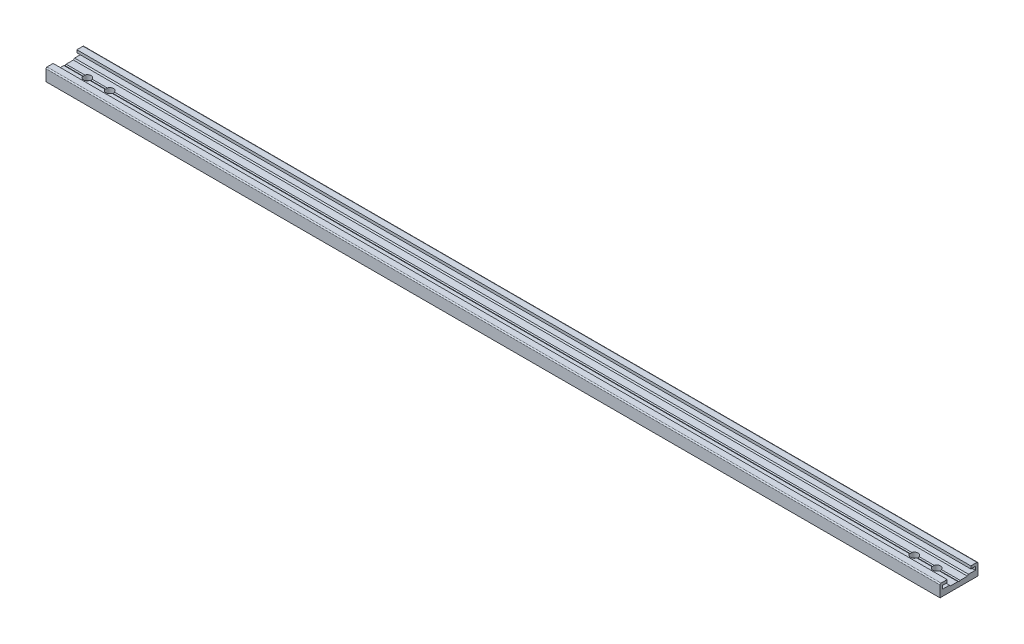
ISO-10303-21;
HEADER;
FILE_DESCRIPTION(('STEP AP214'),'2;1');
FILE_NAME('part.step','',(''),(''),'','','');
FILE_SCHEMA(('AUTOMOTIVE_DESIGN { 1 0 10303 214 1 1 1 1 }'));
ENDSEC;
DATA;
#1=APPLICATION_CONTEXT('core data for automotive mechanical design processes');
#2=APPLICATION_PROTOCOL_DEFINITION('international standard','automotive_design',2000,#1);
#3=PRODUCT_CONTEXT('',#1,'mechanical');
#4=PRODUCT('Part','Part','',(#3));
#5=PRODUCT_RELATED_PRODUCT_CATEGORY('part','',(#4));
#6=PRODUCT_DEFINITION_FORMATION('','',#4);
#7=PRODUCT_DEFINITION_CONTEXT('part definition',#1,'design');
#8=PRODUCT_DEFINITION('design','',#6,#7);
#9=PRODUCT_DEFINITION_SHAPE('','',#8);
#10=(LENGTH_UNIT() NAMED_UNIT(*) SI_UNIT(.MILLI.,.METRE.));
#11=(NAMED_UNIT(*) PLANE_ANGLE_UNIT() SI_UNIT($,.RADIAN.));
#12=(NAMED_UNIT(*) SI_UNIT($,.STERADIAN.) SOLID_ANGLE_UNIT());
#13=UNCERTAINTY_MEASURE_WITH_UNIT(LENGTH_MEASURE(1.E-05),#10,'distance_accuracy_value','');
#14=(GEOMETRIC_REPRESENTATION_CONTEXT(3) GLOBAL_UNCERTAINTY_ASSIGNED_CONTEXT((#13)) GLOBAL_UNIT_ASSIGNED_CONTEXT((#10,
#11,#12)) REPRESENTATION_CONTEXT('',''));
#15=CARTESIAN_POINT('',(0.,0.,0.));
#16=DIRECTION('',(0.,0.,1.));
#17=DIRECTION('',(1.,0.,0.));
#18=AXIS2_PLACEMENT_3D('',#15,#16,#17);
#19=CARTESIAN_POINT('',(400.,-0.45,0.499999998010386));
#20=DIRECTION('',(0.,-0.866025403784438,0.500000000000001));
#21=DIRECTION('',(0.,0.500000000000001,0.866025403784438));
#22=AXIS2_PLACEMENT_3D('',#19,#20,#21);
#23=PLANE('',#22);
#24=DIRECTION('',(-1.,0.,0.));
#25=VECTOR('',#24,1.);
#26=CARTESIAN_POINT('',(400.,-0.738675133446109,0.));
#27=LINE('',#26,#25);
#28=CARTESIAN_POINT('',(388.3,-0.738675133446109,0.));
#29=VERTEX_POINT('',#28);
#30=CARTESIAN_POINT('',(381.7,-0.738675133446109,0.));
#31=VERTEX_POINT('',#30);
#32=EDGE_CURVE('E547',#29,#31,#27,.T.);
#33=ORIENTED_EDGE('',*,*,#32,.T.);
#34=CARTESIAN_POINT('',(380.,-0.738675133446109,0.));
#35=DIRECTION('',(0.,0.866025403784438,-0.500000000000001));
#36=DIRECTION('',(0.,-0.500000000000001,-0.866025403784438));
#37=AXIS2_PLACEMENT_3D('',#34,#35,#36);
#38=ELLIPSE('',#37,1.9629909152447,1.69999999999998);
#39=CARTESIAN_POINT('',(381.624807681539,-0.45,0.499999998010386));
#40=VERTEX_POINT('',#39);
#41=EDGE_CURVE('E458',#40,#31,#38,.T.);
#42=ORIENTED_EDGE('',*,*,#41,.F.);
#43=DIRECTION('',(-1.,0.,0.));
#44=VECTOR('',#43,1.);
#45=CARTESIAN_POINT('',(400.,-0.45,0.499999998010386));
#46=LINE('',#45,#44);
#47=CARTESIAN_POINT('',(388.375192318461,-0.45,0.499999998010386));
#48=VERTEX_POINT('',#47);
#49=EDGE_CURVE('E550',#48,#40,#46,.T.);
#50=ORIENTED_EDGE('',*,*,#49,.F.);
#51=CARTESIAN_POINT('',(390.,-0.738675133446109,0.));
#52=DIRECTION('',(0.,0.866025403784438,-0.500000000000001));
#53=DIRECTION('',(0.,-0.500000000000001,-0.866025403784438));
#54=AXIS2_PLACEMENT_3D('',#51,#52,#53);
#55=ELLIPSE('',#54,1.9629909152447,1.69999999999998);
#56=EDGE_CURVE('E470',#29,#48,#55,.T.);
#57=ORIENTED_EDGE('',*,*,#56,.F.);
#58=EDGE_LOOP('',(#33,#42,#50,#57));
#59=FACE_BOUND('',#58,.T.);
#60=ADVANCED_FACE('F35',(#59),#23,.F.);
#61=CARTESIAN_POINT('',(400.,-0.45,-0.499999998010387));
#62=DIRECTION('',(0.,-0.866025403784438,-0.5));
#63=DIRECTION('',(0.,-0.5,0.866025403784439));
#64=AXIS2_PLACEMENT_3D('',#61,#62,#63);
#65=PLANE('',#64);
#66=CARTESIAN_POINT('',(400.,-0.738675133446109,0.));
#67=VERTEX_POINT('',#66);
#68=CARTESIAN_POINT('',(391.7,-0.738675133446109,0.));
#69=VERTEX_POINT('',#68);
#70=EDGE_CURVE('E543',#67,#69,#27,.T.);
#71=ORIENTED_EDGE('',*,*,#70,.F.);
#72=DIRECTION('',(0.,0.5,-0.866025403784438));
#73=VECTOR('',#72,1.);
#74=CARTESIAN_POINT('',(400.,-0.45,-0.499999998010387));
#75=LINE('',#74,#73);
#76=CARTESIAN_POINT('',(400.,-0.45,-0.499999998010387));
#77=VERTEX_POINT('',#76);
#78=EDGE_CURVE('E268',#67,#77,#75,.T.);
#79=ORIENTED_EDGE('',*,*,#78,.T.);
#80=DIRECTION('',(-1.,0.,0.));
#81=VECTOR('',#80,1.);
#82=CARTESIAN_POINT('',(400.,-0.45,-0.499999998010387));
#83=LINE('',#82,#81);
#84=CARTESIAN_POINT('',(391.624807681539,-0.450000000000001,-0.499999998010386));
#85=VERTEX_POINT('',#84);
#86=EDGE_CURVE('E251',#77,#85,#83,.T.);
#87=ORIENTED_EDGE('',*,*,#86,.T.);
#88=CARTESIAN_POINT('',(390.,-0.738675133446109,0.));
#89=DIRECTION('',(0.,0.866025403784438,0.5));
#90=DIRECTION('',(0.,-0.5,0.866025403784439));
#91=AXIS2_PLACEMENT_3D('',#88,#89,#90);
#92=ELLIPSE('',#91,1.9629909152447,1.69999999999998);
#93=EDGE_CURVE('E256',#69,#85,#92,.T.);
#94=ORIENTED_EDGE('',*,*,#93,.F.);
#95=EDGE_LOOP('',(#71,#79,#87,#94));
#96=FACE_BOUND('',#95,.T.);
#97=ADVANCED_FACE('F266',(#96),#65,.F.);
#98=CARTESIAN_POINT('',(388.375192318461,-0.450000000000001,-0.499999998010386));
#99=VERTEX_POINT('',#98);
#100=CARTESIAN_POINT('',(381.624807681539,-0.450000000000001,-0.499999998010386));
#101=VERTEX_POINT('',#100);
#102=EDGE_CURVE('E254',#99,#101,#83,.T.);
#103=ORIENTED_EDGE('',*,*,#102,.T.);
#104=CARTESIAN_POINT('',(380.,-0.738675133446109,0.));
#105=DIRECTION('',(0.,0.866025403784438,0.5));
#106=DIRECTION('',(0.,-0.5,0.866025403784439));
#107=AXIS2_PLACEMENT_3D('',#104,#105,#106);
#108=ELLIPSE('',#107,1.9629909152447,1.69999999999998);
#109=EDGE_CURVE('E461',#31,#101,#108,.T.);
#110=ORIENTED_EDGE('',*,*,#109,.F.);
#111=ORIENTED_EDGE('',*,*,#32,.F.);
#112=EDGE_CURVE('E264',#99,#29,#92,.T.);
#113=ORIENTED_EDGE('',*,*,#112,.F.);
#114=EDGE_LOOP('',(#103,#110,#111,#113));
#115=FACE_BOUND('',#114,.T.);
#116=ADVANCED_FACE('F496',(#115),#65,.F.);
#117=CARTESIAN_POINT('',(378.3,-0.738675133446109,0.));
#118=VERTEX_POINT('',#117);
#119=CARTESIAN_POINT('',(21.7000000000002,-0.738675133446109,0.));
#120=VERTEX_POINT('',#119);
#121=EDGE_CURVE('E275',#118,#120,#27,.T.);
#122=ORIENTED_EDGE('',*,*,#121,.T.);
#123=CARTESIAN_POINT('',(20.,-0.73867513344611,0.));
#124=DIRECTION('',(0.,0.866025403784438,-0.500000000000001));
#125=DIRECTION('',(0.,-0.500000000000001,-0.866025403784438));
#126=AXIS2_PLACEMENT_3D('',#123,#124,#125);
#127=ELLIPSE('',#126,1.96299091524472,1.69999999999999);
#128=CARTESIAN_POINT('',(21.6248076815395,-0.45,0.499999998010385));
#129=VERTEX_POINT('',#128);
#130=EDGE_CURVE('E377',#129,#120,#127,.T.);
#131=ORIENTED_EDGE('',*,*,#130,.F.);
#132=CARTESIAN_POINT('',(378.375192318461,-0.45,0.499999998010386));
#133=VERTEX_POINT('',#132);
#134=EDGE_CURVE('E545',#133,#129,#46,.T.);
#135=ORIENTED_EDGE('',*,*,#134,.F.);
#136=EDGE_CURVE('E457',#118,#133,#38,.T.);
#137=ORIENTED_EDGE('',*,*,#136,.F.);
#138=EDGE_LOOP('',(#122,#131,#135,#137));
#139=FACE_BOUND('',#138,.T.);
#140=ADVANCED_FACE('F491',(#139),#23,.F.);
#141=CARTESIAN_POINT('',(8.3000000000002,-0.738675133446109,0.));
#142=VERTEX_POINT('',#141);
#143=CARTESIAN_POINT('',(0.,-0.738675133446109,0.));
#144=VERTEX_POINT('',#143);
#145=EDGE_CURVE('E269',#142,#144,#27,.T.);
#146=ORIENTED_EDGE('',*,*,#145,.T.);
#147=DIRECTION('',(0.,-0.500000000000001,-0.866025403784438));
#148=VECTOR('',#147,1.);
#149=CARTESIAN_POINT('',(0.,-0.45,0.499999998010386));
#150=LINE('',#149,#148);
#151=CARTESIAN_POINT('',(0.,-0.45,0.499999998010386));
#152=VERTEX_POINT('',#151);
#153=EDGE_CURVE('E342',#152,#144,#150,.T.);
#154=ORIENTED_EDGE('',*,*,#153,.F.);
#155=CARTESIAN_POINT('',(8.37519231846057,-0.45,0.499999998010386));
#156=VERTEX_POINT('',#155);
#157=EDGE_CURVE('E539',#156,#152,#46,.T.);
#158=ORIENTED_EDGE('',*,*,#157,.F.);
#159=CARTESIAN_POINT('',(10.,-0.738675133446109,0.));
#160=DIRECTION('',(0.,0.866025403784438,-0.500000000000001));
#161=DIRECTION('',(0.,-0.500000000000001,-0.866025403784438));
#162=AXIS2_PLACEMENT_3D('',#159,#160,#161);
#163=ELLIPSE('',#162,1.96299091524472,1.69999999999999);
#164=EDGE_CURVE('E446',#142,#156,#163,.T.);
#165=ORIENTED_EDGE('',*,*,#164,.F.);
#166=EDGE_LOOP('',(#146,#154,#158,#165));
#167=FACE_BOUND('',#166,.T.);
#168=ADVANCED_FACE('F502',(#167),#23,.F.);
#169=CARTESIAN_POINT('',(18.3000000000002,-0.738675133446109,0.));
#170=VERTEX_POINT('',#169);
#171=CARTESIAN_POINT('',(11.7000000000002,-0.738675133446109,0.));
#172=VERTEX_POINT('',#171);
#173=EDGE_CURVE('E273',#170,#172,#27,.T.);
#174=ORIENTED_EDGE('',*,*,#173,.F.);
#175=CARTESIAN_POINT('',(20.,-0.738675133446109,0.));
#176=DIRECTION('',(0.,0.866025403784438,0.5));
#177=DIRECTION('',(0.,-0.5,0.866025403784439));
#178=AXIS2_PLACEMENT_3D('',#175,#176,#177);
#179=ELLIPSE('',#178,1.96299091524472,1.69999999999999);
#180=CARTESIAN_POINT('',(18.3751923184607,-0.45,-0.499999998010387));
#181=VERTEX_POINT('',#180);
#182=EDGE_CURVE('E586',#181,#170,#179,.T.);
#183=ORIENTED_EDGE('',*,*,#182,.F.);
#184=CARTESIAN_POINT('',(11.6248076815395,-0.450000000000001,-0.499999998010386));
#185=VERTEX_POINT('',#184);
#186=EDGE_CURVE('E271',#181,#185,#83,.T.);
#187=ORIENTED_EDGE('',*,*,#186,.T.);
#188=CARTESIAN_POINT('',(10.,-0.738675133446109,0.));
#189=DIRECTION('',(0.,0.866025403784438,0.5));
#190=DIRECTION('',(0.,-0.5,0.866025403784439));
#191=AXIS2_PLACEMENT_3D('',#188,#189,#190);
#192=ELLIPSE('',#191,1.96299091524472,1.69999999999999);
#193=EDGE_CURVE('E449',#172,#185,#192,.T.);
#194=ORIENTED_EDGE('',*,*,#193,.F.);
#195=EDGE_LOOP('',(#174,#183,#187,#194));
#196=FACE_BOUND('',#195,.T.);
#197=ADVANCED_FACE('F517',(#196),#65,.F.);
#198=CARTESIAN_POINT('',(18.3751923184606,-0.45,0.499999998010386));
#199=VERTEX_POINT('',#198);
#200=CARTESIAN_POINT('',(11.6248076815395,-0.45,0.499999998010386));
#201=VERTEX_POINT('',#200);
#202=EDGE_CURVE('E542',#199,#201,#46,.T.);
#203=ORIENTED_EDGE('',*,*,#202,.F.);
#204=EDGE_CURVE('E436',#170,#199,#127,.T.);
#205=ORIENTED_EDGE('',*,*,#204,.F.);
#206=ORIENTED_EDGE('',*,*,#173,.T.);
#207=EDGE_CURVE('E447',#201,#172,#163,.T.);
#208=ORIENTED_EDGE('',*,*,#207,.F.);
#209=EDGE_LOOP('',(#203,#205,#206,#208));
#210=FACE_BOUND('',#209,.T.);
#211=ADVANCED_FACE('F507',(#210),#23,.F.);
#212=CARTESIAN_POINT('',(378.375192318461,-0.450000000000001,-0.499999998010386));
#213=VERTEX_POINT('',#212);
#214=CARTESIAN_POINT('',(21.6248076815395,-0.450000000000001,-0.499999998010386));
#215=VERTEX_POINT('',#214);
#216=EDGE_CURVE('E276',#213,#215,#83,.T.);
#217=ORIENTED_EDGE('',*,*,#216,.T.);
#218=EDGE_CURVE('E588',#120,#215,#179,.T.);
#219=ORIENTED_EDGE('',*,*,#218,.F.);
#220=ORIENTED_EDGE('',*,*,#121,.F.);
#221=EDGE_CURVE('E462',#213,#118,#108,.T.);
#222=ORIENTED_EDGE('',*,*,#221,.F.);
#223=EDGE_LOOP('',(#217,#219,#220,#222));
#224=FACE_BOUND('',#223,.T.);
#225=ADVANCED_FACE('F512',(#224),#65,.F.);
#226=CARTESIAN_POINT('',(400.,-2.75,-8.49999999602077));
#227=DIRECTION('',(0.,0.,1.));
#228=DIRECTION('',(0.,1.,0.));
#229=AXIS2_PLACEMENT_3D('',#226,#227,#228);
#230=PLANE('',#229);
#231=DIRECTION('',(0.,-1.,0.));
#232=VECTOR('',#231,1.);
#233=CARTESIAN_POINT('',(0.,-2.75,-8.49999999602077));
#234=LINE('',#233,#232);
#235=CARTESIAN_POINT('',(0.,2.25,-8.49999999602078));
#236=VERTEX_POINT('',#235);
#237=CARTESIAN_POINT('',(0.,-2.75,-8.49999999602077));
#238=VERTEX_POINT('',#237);
#239=EDGE_CURVE('E374',#236,#238,#234,.T.);
#240=ORIENTED_EDGE('',*,*,#239,.F.);
#241=DIRECTION('',(-1.,0.,0.));
#242=VECTOR('',#241,1.);
#243=CARTESIAN_POINT('',(400.,2.25,-8.49999999602078));
#244=LINE('',#243,#242);
#245=CARTESIAN_POINT('',(400.,2.25,-8.49999999602078));
#246=VERTEX_POINT('',#245);
#247=EDGE_CURVE('E311',#246,#236,#244,.T.);
#248=ORIENTED_EDGE('',*,*,#247,.F.);
#249=DIRECTION('',(0.,-1.,0.));
#250=VECTOR('',#249,1.);
#251=CARTESIAN_POINT('',(400.,-2.75,-8.49999999602077));
#252=LINE('',#251,#250);
#253=CARTESIAN_POINT('',(400.,-2.75,-8.49999999602077));
#254=VERTEX_POINT('',#253);
#255=EDGE_CURVE('E317',#246,#254,#252,.T.);
#256=ORIENTED_EDGE('',*,*,#255,.T.);
#257=DIRECTION('',(-1.,0.,0.));
#258=VECTOR('',#257,1.);
#259=CARTESIAN_POINT('',(400.,-2.75,-8.49999999602077));
#260=LINE('',#259,#258);
#261=EDGE_CURVE('E583',#254,#238,#260,.T.);
#262=ORIENTED_EDGE('',*,*,#261,.T.);
#263=EDGE_LOOP('',(#240,#248,#256,#262));
#264=FACE_BOUND('',#263,.T.);
#265=ADVANCED_FACE('F37',(#264),#230,.F.);
#266=CARTESIAN_POINT('',(400.,-2.75,-8.49999999602077));
#267=DIRECTION('',(0.,1.,0.));
#268=DIRECTION('',(0.,0.,-1.));
#269=AXIS2_PLACEMENT_3D('',#266,#267,#268);
#270=PLANE('',#269);
#271=CARTESIAN_POINT('',(390.,-2.75,0.));
#272=DIRECTION('',(0.,1.,0.));
#273=DIRECTION('',(0.,0.,1.));
#274=AXIS2_PLACEMENT_3D('',#271,#272,#273);
#275=CIRCLE('',#274,1.69999999999998);
#276=CARTESIAN_POINT('',(390.,-2.75,1.69999999999998));
#277=VERTEX_POINT('',#276);
#278=EDGE_CURVE('E472',#277,#277,#275,.T.);
#279=ORIENTED_EDGE('',*,*,#278,.T.);
#280=EDGE_LOOP('',(#279));
#281=FACE_BOUND('',#280,.T.);
#282=CARTESIAN_POINT('',(380.,-2.75,0.));
#283=DIRECTION('',(0.,1.,0.));
#284=DIRECTION('',(0.,0.,1.));
#285=AXIS2_PLACEMENT_3D('',#282,#283,#284);
#286=CIRCLE('',#285,1.69999999999998);
#287=CARTESIAN_POINT('',(380.,-2.75,1.69999999999998));
#288=VERTEX_POINT('',#287);
#289=EDGE_CURVE('E465',#288,#288,#286,.T.);
#290=ORIENTED_EDGE('',*,*,#289,.T.);
#291=EDGE_LOOP('',(#290));
#292=FACE_BOUND('',#291,.T.);
#293=CARTESIAN_POINT('',(10.,-2.75,0.));
#294=DIRECTION('',(0.,1.,0.));
#295=DIRECTION('',(0.,0.,1.));
#296=AXIS2_PLACEMENT_3D('',#293,#294,#295);
#297=CIRCLE('',#296,1.69999999999999);
#298=CARTESIAN_POINT('',(10.,-2.75,1.69999999999999));
#299=VERTEX_POINT('',#298);
#300=EDGE_CURVE('E452',#299,#299,#297,.T.);
#301=ORIENTED_EDGE('',*,*,#300,.T.);
#302=EDGE_LOOP('',(#301));
#303=FACE_BOUND('',#302,.T.);
#304=CARTESIAN_POINT('',(20.,-2.75,0.));
#305=DIRECTION('',(0.,1.,0.));
#306=DIRECTION('',(0.,0.,1.));
#307=AXIS2_PLACEMENT_3D('',#304,#305,#306);
#308=CIRCLE('',#307,1.69999999999999);
#309=CARTESIAN_POINT('',(20.,-2.75,1.69999999999999));
#310=VERTEX_POINT('',#309);
#311=EDGE_CURVE('E441',#310,#310,#308,.T.);
#312=ORIENTED_EDGE('',*,*,#311,.T.);
#313=EDGE_LOOP('',(#312));
#314=FACE_BOUND('',#313,.T.);
#315=DIRECTION('',(0.,0.,1.));
#316=VECTOR('',#315,1.);
#317=CARTESIAN_POINT('',(0.,-2.75,-8.49999999602077));
#318=LINE('',#317,#316);
#319=CARTESIAN_POINT('',(0.,-2.75,8.49999999602077));
#320=VERTEX_POINT('',#319);
#321=EDGE_CURVE('E371',#238,#320,#318,.T.);
#322=ORIENTED_EDGE('',*,*,#321,.F.);
#323=ORIENTED_EDGE('',*,*,#261,.F.);
#324=DIRECTION('',(0.,0.,1.));
#325=VECTOR('',#324,1.);
#326=CARTESIAN_POINT('',(400.,-2.75,-8.49999999602077));
#327=LINE('',#326,#325);
#328=CARTESIAN_POINT('',(400.,-2.75,8.49999999602077));
#329=VERTEX_POINT('',#328);
#330=EDGE_CURVE('E429',#254,#329,#327,.T.);
#331=ORIENTED_EDGE('',*,*,#330,.T.);
#332=DIRECTION('',(-1.,0.,0.));
#333=VECTOR('',#332,1.);
#334=CARTESIAN_POINT('',(400.,-2.75,8.49999999602077));
#335=LINE('',#334,#333);
#336=EDGE_CURVE('E580',#329,#320,#335,.T.);
#337=ORIENTED_EDGE('',*,*,#336,.T.);
#338=EDGE_LOOP('',(#322,#323,#331,#337));
#339=FACE_BOUND('',#338,.T.);
#340=ADVANCED_FACE('F476',(#281,#292,#303,#314,#339),#270,.F.);
#341=CARTESIAN_POINT('',(400.,-2.75,8.49999999602077));
#342=DIRECTION('',(0.,0.,-1.));
#343=DIRECTION('',(1.,0.,0.));
#344=AXIS2_PLACEMENT_3D('',#341,#342,#343);
#345=PLANE('',#344);
#346=DIRECTION('',(0.,1.,0.));
#347=VECTOR('',#346,1.);
#348=CARTESIAN_POINT('',(0.,-2.75,8.49999999602077));
#349=LINE('',#348,#347);
#350=CARTESIAN_POINT('',(0.,2.25,8.49999999602077));
#351=VERTEX_POINT('',#350);
#352=EDGE_CURVE('E368',#320,#351,#349,.T.);
#353=ORIENTED_EDGE('',*,*,#352,.F.);
#354=ORIENTED_EDGE('',*,*,#336,.F.);
#355=DIRECTION('',(0.,1.,0.));
#356=VECTOR('',#355,1.);
#357=CARTESIAN_POINT('',(400.,-2.75,8.49999999602077));
#358=LINE('',#357,#356);
#359=CARTESIAN_POINT('',(400.,2.25,8.49999999602077));
#360=VERTEX_POINT('',#359);
#361=EDGE_CURVE('E426',#329,#360,#358,.T.);
#362=ORIENTED_EDGE('',*,*,#361,.T.);
#363=DIRECTION('',(-1.,0.,0.));
#364=VECTOR('',#363,1.);
#365=CARTESIAN_POINT('',(400.,2.25,8.49999999602077));
#366=LINE('',#365,#364);
#367=EDGE_CURVE('E577',#360,#351,#366,.T.);
#368=ORIENTED_EDGE('',*,*,#367,.T.);
#369=EDGE_LOOP('',(#353,#354,#362,#368));
#370=FACE_BOUND('',#369,.T.);
#371=ADVANCED_FACE('F792',(#370),#345,.F.);
#372=CARTESIAN_POINT('',(400.,2.25,7.99999999602077));
#373=DIRECTION('',(-1.,0.,0.));
#374=DIRECTION('',(0.,0.,-1.));
#375=AXIS2_PLACEMENT_3D('',#372,#373,#374);
#376=CYLINDRICAL_SURFACE('',#375,0.5);
#377=CARTESIAN_POINT('',(0.,2.25,7.99999999602077));
#378=DIRECTION('',(-1.,0.,0.));
#379=DIRECTION('',(0.,0.,1.));
#380=AXIS2_PLACEMENT_3D('',#377,#378,#379);
#381=CIRCLE('',#380,0.5);
#382=CARTESIAN_POINT('',(0.,2.75,7.99999999602077));
#383=VERTEX_POINT('',#382);
#384=EDGE_CURVE('E365',#351,#383,#381,.T.);
#385=ORIENTED_EDGE('',*,*,#384,.F.);
#386=ORIENTED_EDGE('',*,*,#367,.F.);
#387=CARTESIAN_POINT('',(400.,2.25,7.99999999602077));
#388=DIRECTION('',(-1.,0.,0.));
#389=DIRECTION('',(0.,0.,1.));
#390=AXIS2_PLACEMENT_3D('',#387,#388,#389);
#391=CIRCLE('',#390,0.5);
#392=CARTESIAN_POINT('',(400.,2.75,7.99999999602077));
#393=VERTEX_POINT('',#392);
#394=EDGE_CURVE('E423',#360,#393,#391,.T.);
#395=ORIENTED_EDGE('',*,*,#394,.T.);
#396=DIRECTION('',(-1.,0.,0.));
#397=VECTOR('',#396,1.);
#398=CARTESIAN_POINT('',(400.,2.75,7.99999999602077));
#399=LINE('',#398,#397);
#400=EDGE_CURVE('E574',#393,#383,#399,.T.);
#401=ORIENTED_EDGE('',*,*,#400,.T.);
#402=EDGE_LOOP('',(#385,#386,#395,#401));
#403=FACE_BOUND('',#402,.T.);
#404=ADVANCED_FACE('F800',(#403),#376,.T.);
#405=CARTESIAN_POINT('',(400.,2.75,7.99999999602077));
#406=DIRECTION('',(0.,-1.,0.));
#407=DIRECTION('',(0.,0.,1.));
#408=AXIS2_PLACEMENT_3D('',#405,#406,#407);
#409=PLANE('',#408);
#410=DIRECTION('',(0.,0.,-1.));
#411=VECTOR('',#410,1.);
#412=CARTESIAN_POINT('',(0.,2.75,7.99999999602077));
#413=LINE('',#412,#411);
#414=CARTESIAN_POINT('',(0.,2.75,5.29999999602078));
#415=VERTEX_POINT('',#414);
#416=EDGE_CURVE('E362',#383,#415,#413,.T.);
#417=ORIENTED_EDGE('',*,*,#416,.F.);
#418=ORIENTED_EDGE('',*,*,#400,.F.);
#419=DIRECTION('',(0.,0.,-1.));
#420=VECTOR('',#419,1.);
#421=CARTESIAN_POINT('',(400.,2.75,7.99999999602077));
#422=LINE('',#421,#420);
#423=CARTESIAN_POINT('',(400.,2.75,5.29999999602078));
#424=VERTEX_POINT('',#423);
#425=EDGE_CURVE('E420',#393,#424,#422,.T.);
#426=ORIENTED_EDGE('',*,*,#425,.T.);
#427=DIRECTION('',(-1.,0.,0.));
#428=VECTOR('',#427,1.);
#429=CARTESIAN_POINT('',(400.,2.75,5.29999999602078));
#430=LINE('',#429,#428);
#431=EDGE_CURVE('E571',#424,#415,#430,.T.);
#432=ORIENTED_EDGE('',*,*,#431,.T.);
#433=EDGE_LOOP('',(#417,#418,#426,#432));
#434=FACE_BOUND('',#433,.T.);
#435=ADVANCED_FACE('F810',(#434),#409,.F.);
#436=CARTESIAN_POINT('',(400.,2.75,5.29999999602078));
#437=DIRECTION('',(0.,0.,1.));
#438=DIRECTION('',(0.,1.,0.));
#439=AXIS2_PLACEMENT_3D('',#436,#437,#438);
#440=PLANE('',#439);
#441=DIRECTION('',(0.,-1.,0.));
#442=VECTOR('',#441,1.);
#443=CARTESIAN_POINT('',(0.,2.75,5.29999999602078));
#444=LINE('',#443,#442);
#445=CARTESIAN_POINT('',(0.,1.55,5.29999999602078));
#446=VERTEX_POINT('',#445);
#447=EDGE_CURVE('E359',#415,#446,#444,.T.);
#448=ORIENTED_EDGE('',*,*,#447,.F.);
#449=ORIENTED_EDGE('',*,*,#431,.F.);
#450=DIRECTION('',(0.,-1.,0.));
#451=VECTOR('',#450,1.);
#452=CARTESIAN_POINT('',(400.,2.75,5.29999999602078));
#453=LINE('',#452,#451);
#454=CARTESIAN_POINT('',(400.,1.55,5.29999999602078));
#455=VERTEX_POINT('',#454);
#456=EDGE_CURVE('E417',#424,#455,#453,.T.);
#457=ORIENTED_EDGE('',*,*,#456,.T.);
#458=DIRECTION('',(-1.,0.,0.));
#459=VECTOR('',#458,1.);
#460=CARTESIAN_POINT('',(400.,1.55,5.29999999602078));
#461=LINE('',#460,#459);
#462=EDGE_CURVE('E568',#455,#446,#461,.T.);
#463=ORIENTED_EDGE('',*,*,#462,.T.);
#464=EDGE_LOOP('',(#448,#449,#457,#463));
#465=FACE_BOUND('',#464,.T.);
#466=ADVANCED_FACE('F820',(#465),#440,.F.);
#467=CARTESIAN_POINT('',(400.,1.55,5.29999999602078));
#468=DIRECTION('',(0.,1.,0.));
#469=DIRECTION('',(0.,0.,-1.));
#470=AXIS2_PLACEMENT_3D('',#467,#468,#469);
#471=PLANE('',#470);
#472=DIRECTION('',(0.,0.,1.));
#473=VECTOR('',#472,1.);
#474=CARTESIAN_POINT('',(0.,1.55,5.29999999602078));
#475=LINE('',#474,#473);
#476=CARTESIAN_POINT('',(0.,1.55,7.29999999801039));
#477=VERTEX_POINT('',#476);
#478=EDGE_CURVE('E356',#446,#477,#475,.T.);
#479=ORIENTED_EDGE('',*,*,#478,.F.);
#480=ORIENTED_EDGE('',*,*,#462,.F.);
#481=DIRECTION('',(0.,0.,1.));
#482=VECTOR('',#481,1.);
#483=CARTESIAN_POINT('',(400.,1.55,5.29999999602078));
#484=LINE('',#483,#482);
#485=CARTESIAN_POINT('',(400.,1.55,7.29999999801039));
#486=VERTEX_POINT('',#485);
#487=EDGE_CURVE('E414',#455,#486,#484,.T.);
#488=ORIENTED_EDGE('',*,*,#487,.T.);
#489=DIRECTION('',(-1.,0.,0.));
#490=VECTOR('',#489,1.);
#491=CARTESIAN_POINT('',(400.,1.55,7.29999999801039));
#492=LINE('',#491,#490);
#493=EDGE_CURVE('E565',#486,#477,#492,.T.);
#494=ORIENTED_EDGE('',*,*,#493,.T.);
#495=EDGE_LOOP('',(#479,#480,#488,#494));
#496=FACE_BOUND('',#495,.T.);
#497=ADVANCED_FACE('F830',(#496),#471,.F.);
#498=CARTESIAN_POINT('',(400.,1.55,7.29999999801039));
#499=DIRECTION('',(0.,0.,1.));
#500=DIRECTION('',(0.,1.,0.));
#501=AXIS2_PLACEMENT_3D('',#498,#499,#500);
#502=PLANE('',#501);
#503=DIRECTION('',(0.,-1.,0.));
#504=VECTOR('',#503,1.);
#505=CARTESIAN_POINT('',(0.,1.55,7.29999999801039));
#506=LINE('',#505,#504);
#507=CARTESIAN_POINT('',(0.,0.0500000000000036,7.29999999801039));
#508=VERTEX_POINT('',#507);
#509=EDGE_CURVE('E353',#477,#508,#506,.T.);
#510=ORIENTED_EDGE('',*,*,#509,.F.);
#511=ORIENTED_EDGE('',*,*,#493,.F.);
#512=DIRECTION('',(0.,-1.,0.));
#513=VECTOR('',#512,1.);
#514=CARTESIAN_POINT('',(400.,1.55,7.29999999801039));
#515=LINE('',#514,#513);
#516=CARTESIAN_POINT('',(400.,0.0500000000000036,7.29999999801039));
#517=VERTEX_POINT('',#516);
#518=EDGE_CURVE('E411',#486,#517,#515,.T.);
#519=ORIENTED_EDGE('',*,*,#518,.T.);
#520=DIRECTION('',(-1.,0.,0.));
#521=VECTOR('',#520,1.);
#522=CARTESIAN_POINT('',(400.,0.0500000000000036,7.29999999801039));
#523=LINE('',#522,#521);
#524=EDGE_CURVE('E560',#517,#508,#523,.T.);
#525=ORIENTED_EDGE('',*,*,#524,.T.);
#526=EDGE_LOOP('',(#510,#511,#519,#525));
#527=FACE_BOUND('',#526,.T.);
#528=ADVANCED_FACE('F840',(#527),#502,.F.);
#529=CARTESIAN_POINT('',(400.,0.0500000000000036,7.29999999801039));
#530=DIRECTION('',(0.,-1.,0.));
#531=DIRECTION('',(0.,0.,1.));
#532=AXIS2_PLACEMENT_3D('',#529,#530,#531);
#533=PLANE('',#532);
#534=DIRECTION('',(0.,0.,-1.));
#535=VECTOR('',#534,1.);
#536=CARTESIAN_POINT('',(0.,0.0500000000000036,7.29999999801039));
#537=LINE('',#536,#535);
#538=CARTESIAN_POINT('',(0.,0.0500000000000001,4.24999999801039));
#539=VERTEX_POINT('',#538);
#540=EDGE_CURVE('E350',#508,#539,#537,.T.);
#541=ORIENTED_EDGE('',*,*,#540,.F.);
#542=ORIENTED_EDGE('',*,*,#524,.F.);
#543=DIRECTION('',(0.,0.,-1.));
#544=VECTOR('',#543,1.);
#545=CARTESIAN_POINT('',(400.,0.0500000000000036,7.29999999801039));
#546=LINE('',#545,#544);
#547=CARTESIAN_POINT('',(400.,0.0500000000000001,4.24999999801039));
#548=VERTEX_POINT('',#547);
#549=EDGE_CURVE('E408',#517,#548,#546,.T.);
#550=ORIENTED_EDGE('',*,*,#549,.T.);
#551=DIRECTION('',(-1.,0.,0.));
#552=VECTOR('',#551,1.);
#553=CARTESIAN_POINT('',(400.,0.0500000000000001,4.24999999801039));
#554=LINE('',#553,#552);
#555=EDGE_CURVE('E557',#548,#539,#554,.T.);
#556=ORIENTED_EDGE('',*,*,#555,.T.);
#557=EDGE_LOOP('',(#541,#542,#550,#556));
#558=FACE_BOUND('',#557,.T.);
#559=ADVANCED_FACE('F850',(#558),#533,.F.);
#560=CARTESIAN_POINT('',(400.,0.0500000000000001,4.24999999801039));
#561=DIRECTION('',(0.,-0.707106781186548,0.707106781186548));
#562=DIRECTION('',(0.,0.707106781186548,0.707106781186548));
#563=AXIS2_PLACEMENT_3D('',#560,#561,#562);
#564=PLANE('',#563);
#565=DIRECTION('',(0.,-0.707106781186548,-0.707106781186548));
#566=VECTOR('',#565,1.);
#567=CARTESIAN_POINT('',(0.,0.0500000000000001,4.24999999801039));
#568=LINE('',#567,#566);
#569=CARTESIAN_POINT('',(0.,-0.45,3.74999999801039));
#570=VERTEX_POINT('',#569);
#571=EDGE_CURVE('E347',#539,#570,#568,.T.);
#572=ORIENTED_EDGE('',*,*,#571,.F.);
#573=ORIENTED_EDGE('',*,*,#555,.F.);
#574=DIRECTION('',(0.,-0.707106781186548,-0.707106781186548));
#575=VECTOR('',#574,1.);
#576=CARTESIAN_POINT('',(400.,0.0500000000000001,4.24999999801039));
#577=LINE('',#576,#575);
#578=CARTESIAN_POINT('',(400.,-0.45,3.74999999801039));
#579=VERTEX_POINT('',#578);
#580=EDGE_CURVE('E405',#548,#579,#577,.T.);
#581=ORIENTED_EDGE('',*,*,#580,.T.);
#582=DIRECTION('',(-1.,0.,0.));
#583=VECTOR('',#582,1.);
#584=CARTESIAN_POINT('',(400.,-0.45,3.74999999801039));
#585=LINE('',#584,#583);
#586=EDGE_CURVE('E556',#579,#570,#585,.T.);
#587=ORIENTED_EDGE('',*,*,#586,.T.);
#588=EDGE_LOOP('',(#572,#573,#581,#587));
#589=FACE_BOUND('',#588,.T.);
#590=ADVANCED_FACE('F513',(#589),#564,.F.);
#591=CARTESIAN_POINT('',(400.,-0.45,3.74999999801039));
#592=DIRECTION('',(0.,-1.,0.));
#593=DIRECTION('',(0.,0.,1.));
#594=AXIS2_PLACEMENT_3D('',#591,#592,#593);
#595=PLANE('',#594);
#596=ORIENTED_EDGE('',*,*,#49,.T.);
#597=CARTESIAN_POINT('',(380.,-0.45,0.));
#598=DIRECTION('',(0.,1.,0.));
#599=DIRECTION('',(0.,0.,1.));
#600=AXIS2_PLACEMENT_3D('',#597,#598,#599);
#601=CIRCLE('',#600,1.69999999999998);
#602=EDGE_CURVE('E455',#133,#40,#601,.T.);
#603=ORIENTED_EDGE('',*,*,#602,.F.);
#604=ORIENTED_EDGE('',*,*,#134,.T.);
#605=CARTESIAN_POINT('',(20.,-0.45,0.));
#606=DIRECTION('',(0.,1.,0.));
#607=DIRECTION('',(0.,0.,1.));
#608=AXIS2_PLACEMENT_3D('',#605,#606,#607);
#609=CIRCLE('',#608,1.69999999999999);
#610=EDGE_CURVE('E434',#199,#129,#609,.T.);
#611=ORIENTED_EDGE('',*,*,#610,.F.);
#612=ORIENTED_EDGE('',*,*,#202,.T.);
#613=CARTESIAN_POINT('',(10.,-0.45,0.));
#614=DIRECTION('',(0.,1.,0.));
#615=DIRECTION('',(0.,0.,1.));
#616=AXIS2_PLACEMENT_3D('',#613,#614,#615);
#617=CIRCLE('',#616,1.69999999999999);
#618=EDGE_CURVE('E444',#156,#201,#617,.T.);
#619=ORIENTED_EDGE('',*,*,#618,.F.);
#620=ORIENTED_EDGE('',*,*,#157,.T.);
#621=DIRECTION('',(0.,0.,-1.));
#622=VECTOR('',#621,1.);
#623=CARTESIAN_POINT('',(0.,-0.45,3.74999999801039));
#624=LINE('',#623,#622);
#625=EDGE_CURVE('E345',#570,#152,#624,.T.);
#626=ORIENTED_EDGE('',*,*,#625,.F.);
#627=ORIENTED_EDGE('',*,*,#586,.F.);
#628=DIRECTION('',(0.,0.,-1.));
#629=VECTOR('',#628,1.);
#630=CARTESIAN_POINT('',(400.,-0.45,3.74999999801039));
#631=LINE('',#630,#629);
#632=CARTESIAN_POINT('',(400.,-0.45,0.499999998010386));
#633=VERTEX_POINT('',#632);
#634=EDGE_CURVE('E402',#579,#633,#631,.T.);
#635=ORIENTED_EDGE('',*,*,#634,.T.);
#636=CARTESIAN_POINT('',(391.624807681539,-0.45,0.499999998010386));
#637=VERTEX_POINT('',#636);
#638=EDGE_CURVE('E546',#633,#637,#46,.T.);
#639=ORIENTED_EDGE('',*,*,#638,.T.);
#640=CARTESIAN_POINT('',(390.,-0.45,0.));
#641=DIRECTION('',(0.,1.,0.));
#642=DIRECTION('',(0.,0.,1.));
#643=AXIS2_PLACEMENT_3D('',#640,#641,#642);
#644=CIRCLE('',#643,1.69999999999998);
#645=EDGE_CURVE('E468',#48,#637,#644,.T.);
#646=ORIENTED_EDGE('',*,*,#645,.F.);
#647=EDGE_LOOP('',(#596,#603,#604,#611,#612,#619,#620,#626,#627,#635,#639,#646));
#648=FACE_BOUND('',#647,.T.);
#649=ADVANCED_FACE('F505',(#648),#595,.F.);
#650=ORIENTED_EDGE('',*,*,#638,.F.);
#651=DIRECTION('',(0.,-0.500000000000001,-0.866025403784438));
#652=VECTOR('',#651,1.);
#653=CARTESIAN_POINT('',(400.,-0.45,0.499999998010386));
#654=LINE('',#653,#652);
#655=EDGE_CURVE('E400',#633,#67,#654,.T.);
#656=ORIENTED_EDGE('',*,*,#655,.T.);
#657=ORIENTED_EDGE('',*,*,#70,.T.);
#658=EDGE_CURVE('E260',#637,#69,#55,.T.);
#659=ORIENTED_EDGE('',*,*,#658,.F.);
#660=EDGE_LOOP('',(#650,#656,#657,#659));
#661=FACE_BOUND('',#660,.T.);
#662=ADVANCED_FACE('F492',(#661),#23,.F.);
#663=CARTESIAN_POINT('',(8.37519231846056,-0.450000000000001,-0.499999998010386));
#664=VERTEX_POINT('',#663);
#665=CARTESIAN_POINT('',(0.,-0.45,-0.499999998010387));
#666=VERTEX_POINT('',#665);
#667=EDGE_CURVE('E279',#664,#666,#83,.T.);
#668=ORIENTED_EDGE('',*,*,#667,.T.);
#669=DIRECTION('',(0.,0.5,-0.866025403784438));
#670=VECTOR('',#669,1.);
#671=CARTESIAN_POINT('',(0.,-0.45,-0.499999998010387));
#672=LINE('',#671,#670);
#673=EDGE_CURVE('E339',#144,#666,#672,.T.);
#674=ORIENTED_EDGE('',*,*,#673,.F.);
#675=ORIENTED_EDGE('',*,*,#145,.F.);
#676=EDGE_CURVE('E450',#664,#142,#192,.T.);
#677=ORIENTED_EDGE('',*,*,#676,.F.);
#678=EDGE_LOOP('',(#668,#674,#675,#677));
#679=FACE_BOUND('',#678,.T.);
#680=ADVANCED_FACE('F498',(#679),#65,.F.);
#681=CARTESIAN_POINT('',(400.,-0.450000000000002,-3.74999999801039));
#682=DIRECTION('',(0.,-1.,0.));
#683=DIRECTION('',(0.,0.,1.));
#684=AXIS2_PLACEMENT_3D('',#681,#682,#683);
#685=PLANE('',#684);
#686=ORIENTED_EDGE('',*,*,#86,.F.);
#687=DIRECTION('',(0.,0.,-1.));
#688=VECTOR('',#687,1.);
#689=CARTESIAN_POINT('',(400.,-0.450000000000002,-3.74999999801039));
#690=LINE('',#689,#688);
#691=CARTESIAN_POINT('',(400.,-0.450000000000002,-3.74999999801039));
#692=VERTEX_POINT('',#691);
#693=EDGE_CURVE('E397',#77,#692,#690,.T.);
#694=ORIENTED_EDGE('',*,*,#693,.T.);
#695=DIRECTION('',(-1.,0.,0.));
#696=VECTOR('',#695,1.);
#697=CARTESIAN_POINT('',(400.,-0.450000000000002,-3.74999999801039));
#698=LINE('',#697,#696);
#699=CARTESIAN_POINT('',(0.,-0.450000000000002,-3.74999999801039));
#700=VERTEX_POINT('',#699);
#701=EDGE_CURVE('E286',#692,#700,#698,.T.);
#702=ORIENTED_EDGE('',*,*,#701,.T.);
#703=DIRECTION('',(0.,0.,-1.));
#704=VECTOR('',#703,1.);
#705=CARTESIAN_POINT('',(0.,-0.450000000000002,-3.74999999801039));
#706=LINE('',#705,#704);
#707=EDGE_CURVE('E336',#666,#700,#706,.T.);
#708=ORIENTED_EDGE('',*,*,#707,.F.);
#709=ORIENTED_EDGE('',*,*,#667,.F.);
#710=CARTESIAN_POINT('',(10.,-0.45,0.));
#711=DIRECTION('',(0.,1.,0.));
#712=DIRECTION('',(0.,0.,1.));
#713=AXIS2_PLACEMENT_3D('',#710,#711,#712);
#714=CIRCLE('',#713,1.69999999999999);
#715=EDGE_CURVE('E43',#185,#664,#714,.T.);
#716=ORIENTED_EDGE('',*,*,#715,.F.);
#717=ORIENTED_EDGE('',*,*,#186,.F.);
#718=CARTESIAN_POINT('',(20.,-0.45,0.));
#719=DIRECTION('',(0.,1.,0.));
#720=DIRECTION('',(0.,0.,1.));
#721=AXIS2_PLACEMENT_3D('',#718,#719,#720);
#722=CIRCLE('',#721,1.69999999999999);
#723=EDGE_CURVE('E439',#215,#181,#722,.T.);
#724=ORIENTED_EDGE('',*,*,#723,.F.);
#725=ORIENTED_EDGE('',*,*,#216,.F.);
#726=CARTESIAN_POINT('',(380.,-0.45,0.));
#727=DIRECTION('',(0.,1.,0.));
#728=DIRECTION('',(0.,0.,1.));
#729=AXIS2_PLACEMENT_3D('',#726,#727,#728);
#730=CIRCLE('',#729,1.69999999999998);
#731=EDGE_CURVE('E56',#101,#213,#730,.T.);
#732=ORIENTED_EDGE('',*,*,#731,.F.);
#733=ORIENTED_EDGE('',*,*,#102,.F.);
#734=CARTESIAN_POINT('',(390.,-0.45,0.));
#735=DIRECTION('',(0.,1.,0.));
#736=DIRECTION('',(0.,0.,1.));
#737=AXIS2_PLACEMENT_3D('',#734,#735,#736);
#738=CIRCLE('',#737,1.69999999999998);
#739=EDGE_CURVE('E11',#85,#99,#738,.T.);
#740=ORIENTED_EDGE('',*,*,#739,.F.);
#741=EDGE_LOOP('',(#686,#694,#702,#708,#709,#716,#717,#724,#725,#732,#733,#740));
#742=FACE_BOUND('',#741,.T.);
#743=ADVANCED_FACE('F248',(#742),#685,.F.);
#744=CARTESIAN_POINT('',(400.,0.0499999999999984,-4.24999999801039));
#745=DIRECTION('',(0.,-0.707106781186548,-0.707106781186547));
#746=DIRECTION('',(0.,-0.707106781186547,0.707106781186548));
#747=AXIS2_PLACEMENT_3D('',#744,#745,#746);
#748=PLANE('',#747);
#749=DIRECTION('',(0.,0.707106781186547,-0.707106781186548));
#750=VECTOR('',#749,1.);
#751=CARTESIAN_POINT('',(0.,0.0499999999999984,-4.24999999801039));
#752=LINE('',#751,#750);
#753=CARTESIAN_POINT('',(0.,0.0499999999999984,-4.24999999801039));
#754=VERTEX_POINT('',#753);
#755=EDGE_CURVE('E333',#700,#754,#752,.T.);
#756=ORIENTED_EDGE('',*,*,#755,.F.);
#757=ORIENTED_EDGE('',*,*,#701,.F.);
#758=DIRECTION('',(0.,0.707106781186547,-0.707106781186548));
#759=VECTOR('',#758,1.);
#760=CARTESIAN_POINT('',(400.,0.0499999999999984,-4.24999999801039));
#761=LINE('',#760,#759);
#762=CARTESIAN_POINT('',(400.,0.0499999999999984,-4.24999999801039));
#763=VERTEX_POINT('',#762);
#764=EDGE_CURVE('E394',#692,#763,#761,.T.);
#765=ORIENTED_EDGE('',*,*,#764,.T.);
#766=DIRECTION('',(-1.,0.,0.));
#767=VECTOR('',#766,1.);
#768=CARTESIAN_POINT('',(400.,0.0499999999999984,-4.24999999801039));
#769=LINE('',#768,#767);
#770=EDGE_CURVE('E291',#763,#754,#769,.T.);
#771=ORIENTED_EDGE('',*,*,#770,.T.);
#772=EDGE_LOOP('',(#756,#757,#765,#771));
#773=FACE_BOUND('',#772,.T.);
#774=ADVANCED_FACE('F640',(#773),#748,.F.);
#775=CARTESIAN_POINT('',(400.,0.050000000000001,-7.29999999801039));
#776=DIRECTION('',(0.,-1.,0.));
#777=DIRECTION('',(0.,0.,1.));
#778=AXIS2_PLACEMENT_3D('',#775,#776,#777);
#779=PLANE('',#778);
#780=DIRECTION('',(0.,0.,-1.));
#781=VECTOR('',#780,1.);
#782=CARTESIAN_POINT('',(0.,0.050000000000001,-7.29999999801039));
#783=LINE('',#782,#781);
#784=CARTESIAN_POINT('',(0.,0.050000000000001,-7.29999999801039));
#785=VERTEX_POINT('',#784);
#786=EDGE_CURVE('E330',#754,#785,#783,.T.);
#787=ORIENTED_EDGE('',*,*,#786,.F.);
#788=ORIENTED_EDGE('',*,*,#770,.F.);
#789=DIRECTION('',(0.,0.,-1.));
#790=VECTOR('',#789,1.);
#791=CARTESIAN_POINT('',(400.,0.050000000000001,-7.29999999801039));
#792=LINE('',#791,#790);
#793=CARTESIAN_POINT('',(400.,0.050000000000001,-7.29999999801039));
#794=VERTEX_POINT('',#793);
#795=EDGE_CURVE('E391',#763,#794,#792,.T.);
#796=ORIENTED_EDGE('',*,*,#795,.T.);
#797=DIRECTION('',(-1.,0.,0.));
#798=VECTOR('',#797,1.);
#799=CARTESIAN_POINT('',(400.,0.050000000000001,-7.29999999801039));
#800=LINE('',#799,#798);
#801=EDGE_CURVE('E294',#794,#785,#800,.T.);
#802=ORIENTED_EDGE('',*,*,#801,.T.);
#803=EDGE_LOOP('',(#787,#788,#796,#802));
#804=FACE_BOUND('',#803,.T.);
#805=ADVANCED_FACE('F636',(#804),#779,.F.);
#806=CARTESIAN_POINT('',(400.,1.55,-7.29999999801039));
#807=DIRECTION('',(0.,0.,-1.));
#808=DIRECTION('',(0.,-1.,0.));
#809=AXIS2_PLACEMENT_3D('',#806,#807,#808);
#810=PLANE('',#809);
#811=DIRECTION('',(0.,1.,0.));
#812=VECTOR('',#811,1.);
#813=CARTESIAN_POINT('',(0.,1.55,-7.29999999801039));
#814=LINE('',#813,#812);
#815=CARTESIAN_POINT('',(0.,1.55,-7.29999999801039));
#816=VERTEX_POINT('',#815);
#817=EDGE_CURVE('E327',#785,#816,#814,.T.);
#818=ORIENTED_EDGE('',*,*,#817,.F.);
#819=ORIENTED_EDGE('',*,*,#801,.F.);
#820=DIRECTION('',(0.,1.,0.));
#821=VECTOR('',#820,1.);
#822=CARTESIAN_POINT('',(400.,1.55,-7.29999999801039));
#823=LINE('',#822,#821);
#824=CARTESIAN_POINT('',(400.,1.55,-7.29999999801039));
#825=VERTEX_POINT('',#824);
#826=EDGE_CURVE('E388',#794,#825,#823,.T.);
#827=ORIENTED_EDGE('',*,*,#826,.T.);
#828=DIRECTION('',(-1.,0.,0.));
#829=VECTOR('',#828,1.);
#830=CARTESIAN_POINT('',(400.,1.55,-7.29999999801039));
#831=LINE('',#830,#829);
#832=EDGE_CURVE('E299',#825,#816,#831,.T.);
#833=ORIENTED_EDGE('',*,*,#832,.T.);
#834=EDGE_LOOP('',(#818,#819,#827,#833));
#835=FACE_BOUND('',#834,.T.);
#836=ADVANCED_FACE('F632',(#835),#810,.F.);
#837=CARTESIAN_POINT('',(400.,1.55,-5.29999999602078));
#838=DIRECTION('',(0.,1.,0.));
#839=DIRECTION('',(0.,0.,-1.));
#840=AXIS2_PLACEMENT_3D('',#837,#838,#839);
#841=PLANE('',#840);
#842=DIRECTION('',(0.,0.,1.));
#843=VECTOR('',#842,1.);
#844=CARTESIAN_POINT('',(0.,1.55,-5.29999999602078));
#845=LINE('',#844,#843);
#846=CARTESIAN_POINT('',(0.,1.55,-5.29999999602078));
#847=VERTEX_POINT('',#846);
#848=EDGE_CURVE('E324',#816,#847,#845,.T.);
#849=ORIENTED_EDGE('',*,*,#848,.F.);
#850=ORIENTED_EDGE('',*,*,#832,.F.);
#851=DIRECTION('',(0.,0.,1.));
#852=VECTOR('',#851,1.);
#853=CARTESIAN_POINT('',(400.,1.55,-5.29999999602078));
#854=LINE('',#853,#852);
#855=CARTESIAN_POINT('',(400.,1.55,-5.29999999602078));
#856=VERTEX_POINT('',#855);
#857=EDGE_CURVE('E385',#825,#856,#854,.T.);
#858=ORIENTED_EDGE('',*,*,#857,.T.);
#859=DIRECTION('',(-1.,0.,0.));
#860=VECTOR('',#859,1.);
#861=CARTESIAN_POINT('',(400.,1.55,-5.29999999602078));
#862=LINE('',#861,#860);
#863=EDGE_CURVE('E302',#856,#847,#862,.T.);
#864=ORIENTED_EDGE('',*,*,#863,.T.);
#865=EDGE_LOOP('',(#849,#850,#858,#864));
#866=FACE_BOUND('',#865,.T.);
#867=ADVANCED_FACE('F628',(#866),#841,.F.);
#868=CARTESIAN_POINT('',(400.,2.75,-5.29999999602078));
#869=DIRECTION('',(0.,0.,-1.));
#870=DIRECTION('',(0.,-1.,0.));
#871=AXIS2_PLACEMENT_3D('',#868,#869,#870);
#872=PLANE('',#871);
#873=DIRECTION('',(0.,1.,0.));
#874=VECTOR('',#873,1.);
#875=CARTESIAN_POINT('',(0.,2.75,-5.29999999602078));
#876=LINE('',#875,#874);
#877=CARTESIAN_POINT('',(0.,2.75,-5.29999999602078));
#878=VERTEX_POINT('',#877);
#879=EDGE_CURVE('E321',#847,#878,#876,.T.);
#880=ORIENTED_EDGE('',*,*,#879,.F.);
#881=ORIENTED_EDGE('',*,*,#863,.F.);
#882=DIRECTION('',(0.,1.,0.));
#883=VECTOR('',#882,1.);
#884=CARTESIAN_POINT('',(400.,2.75,-5.29999999602078));
#885=LINE('',#884,#883);
#886=CARTESIAN_POINT('',(400.,2.75,-5.29999999602078));
#887=VERTEX_POINT('',#886);
#888=EDGE_CURVE('E382',#856,#887,#885,.T.);
#889=ORIENTED_EDGE('',*,*,#888,.T.);
#890=DIRECTION('',(-1.,0.,0.));
#891=VECTOR('',#890,1.);
#892=CARTESIAN_POINT('',(400.,2.75,-5.29999999602078));
#893=LINE('',#892,#891);
#894=EDGE_CURVE('E305',#887,#878,#893,.T.);
#895=ORIENTED_EDGE('',*,*,#894,.T.);
#896=EDGE_LOOP('',(#880,#881,#889,#895));
#897=FACE_BOUND('',#896,.T.);
#898=ADVANCED_FACE('F624',(#897),#872,.F.);
#899=CARTESIAN_POINT('',(400.,2.75,-7.99999999602078));
#900=DIRECTION('',(0.,-1.,0.));
#901=DIRECTION('',(0.,0.,1.));
#902=AXIS2_PLACEMENT_3D('',#899,#900,#901);
#903=PLANE('',#902);
#904=DIRECTION('',(0.,0.,-1.));
#905=VECTOR('',#904,1.);
#906=CARTESIAN_POINT('',(0.,2.75,-7.99999999602078));
#907=LINE('',#906,#905);
#908=CARTESIAN_POINT('',(0.,2.75,-7.99999999602078));
#909=VERTEX_POINT('',#908);
#910=EDGE_CURVE('E318',#878,#909,#907,.T.);
#911=ORIENTED_EDGE('',*,*,#910,.F.);
#912=ORIENTED_EDGE('',*,*,#894,.F.);
#913=DIRECTION('',(0.,0.,-1.));
#914=VECTOR('',#913,1.);
#915=CARTESIAN_POINT('',(400.,2.75,-7.99999999602078));
#916=LINE('',#915,#914);
#917=CARTESIAN_POINT('',(400.,2.75,-7.99999999602078));
#918=VERTEX_POINT('',#917);
#919=EDGE_CURVE('E379',#887,#918,#916,.T.);
#920=ORIENTED_EDGE('',*,*,#919,.T.);
#921=DIRECTION('',(-1.,0.,0.));
#922=VECTOR('',#921,1.);
#923=CARTESIAN_POINT('',(400.,2.75,-7.99999999602078));
#924=LINE('',#923,#922);
#925=EDGE_CURVE('E308',#918,#909,#924,.T.);
#926=ORIENTED_EDGE('',*,*,#925,.T.);
#927=EDGE_LOOP('',(#911,#912,#920,#926));
#928=FACE_BOUND('',#927,.T.);
#929=ADVANCED_FACE('F620',(#928),#903,.F.);
#930=CARTESIAN_POINT('',(400.,2.25,-7.99999999602078));
#931=DIRECTION('',(-1.,0.,0.));
#932=DIRECTION('',(0.,0.,-1.));
#933=AXIS2_PLACEMENT_3D('',#930,#931,#932);
#934=CYLINDRICAL_SURFACE('',#933,0.5);
#935=CARTESIAN_POINT('',(0.,2.25,-7.99999999602078));
#936=DIRECTION('',(-1.,0.,0.));
#937=DIRECTION('',(0.,0.,1.));
#938=AXIS2_PLACEMENT_3D('',#935,#936,#937);
#939=CIRCLE('',#938,0.5);
#940=EDGE_CURVE('E315',#909,#236,#939,.T.);
#941=ORIENTED_EDGE('',*,*,#940,.F.);
#942=ORIENTED_EDGE('',*,*,#925,.F.);
#943=CARTESIAN_POINT('',(400.,2.25,-7.99999999602078));
#944=DIRECTION('',(-1.,0.,0.));
#945=DIRECTION('',(0.,0.,1.));
#946=AXIS2_PLACEMENT_3D('',#943,#944,#945);
#947=CIRCLE('',#946,0.5);
#948=EDGE_CURVE('E314',#918,#246,#947,.T.);
#949=ORIENTED_EDGE('',*,*,#948,.T.);
#950=ORIENTED_EDGE('',*,*,#247,.T.);
#951=EDGE_LOOP('',(#941,#942,#949,#950));
#952=FACE_BOUND('',#951,.T.);
#953=ADVANCED_FACE('F614',(#952),#934,.T.);
#954=CARTESIAN_POINT('',(400.,2.25,-7.99999999602078));
#955=DIRECTION('',(1.,0.,0.));
#956=DIRECTION('',(0.,0.,1.));
#957=AXIS2_PLACEMENT_3D('',#954,#955,#956);
#958=PLANE('',#957);
#959=ORIENTED_EDGE('',*,*,#255,.F.);
#960=ORIENTED_EDGE('',*,*,#948,.F.);
#961=ORIENTED_EDGE('',*,*,#919,.F.);
#962=ORIENTED_EDGE('',*,*,#888,.F.);
#963=ORIENTED_EDGE('',*,*,#857,.F.);
#964=ORIENTED_EDGE('',*,*,#826,.F.);
#965=ORIENTED_EDGE('',*,*,#795,.F.);
#966=ORIENTED_EDGE('',*,*,#764,.F.);
#967=ORIENTED_EDGE('',*,*,#693,.F.);
#968=ORIENTED_EDGE('',*,*,#78,.F.);
#969=ORIENTED_EDGE('',*,*,#655,.F.);
#970=ORIENTED_EDGE('',*,*,#634,.F.);
#971=ORIENTED_EDGE('',*,*,#580,.F.);
#972=ORIENTED_EDGE('',*,*,#549,.F.);
#973=ORIENTED_EDGE('',*,*,#518,.F.);
#974=ORIENTED_EDGE('',*,*,#487,.F.);
#975=ORIENTED_EDGE('',*,*,#456,.F.);
#976=ORIENTED_EDGE('',*,*,#425,.F.);
#977=ORIENTED_EDGE('',*,*,#394,.F.);
#978=ORIENTED_EDGE('',*,*,#361,.F.);
#979=ORIENTED_EDGE('',*,*,#330,.F.);
#980=EDGE_LOOP('',(#959,#960,#961,#962,#963,#964,#965,#966,#967,#968,#969,#970,#971,#972,#973,
#974,#975,#976,#977,#978,#979));
#981=FACE_BOUND('',#980,.T.);
#982=ADVANCED_FACE('F611',(#981),#958,.T.);
#983=CARTESIAN_POINT('',(0.,2.25,-7.99999999602078));
#984=DIRECTION('',(1.,0.,0.));
#985=DIRECTION('',(0.,0.,1.));
#986=AXIS2_PLACEMENT_3D('',#983,#984,#985);
#987=PLANE('',#986);
#988=ORIENTED_EDGE('',*,*,#239,.T.);
#989=ORIENTED_EDGE('',*,*,#321,.T.);
#990=ORIENTED_EDGE('',*,*,#352,.T.);
#991=ORIENTED_EDGE('',*,*,#384,.T.);
#992=ORIENTED_EDGE('',*,*,#416,.T.);
#993=ORIENTED_EDGE('',*,*,#447,.T.);
#994=ORIENTED_EDGE('',*,*,#478,.T.);
#995=ORIENTED_EDGE('',*,*,#509,.T.);
#996=ORIENTED_EDGE('',*,*,#540,.T.);
#997=ORIENTED_EDGE('',*,*,#571,.T.);
#998=ORIENTED_EDGE('',*,*,#625,.T.);
#999=ORIENTED_EDGE('',*,*,#153,.T.);
#1000=ORIENTED_EDGE('',*,*,#673,.T.);
#1001=ORIENTED_EDGE('',*,*,#707,.T.);
#1002=ORIENTED_EDGE('',*,*,#755,.T.);
#1003=ORIENTED_EDGE('',*,*,#786,.T.);
#1004=ORIENTED_EDGE('',*,*,#817,.T.);
#1005=ORIENTED_EDGE('',*,*,#848,.T.);
#1006=ORIENTED_EDGE('',*,*,#879,.T.);
#1007=ORIENTED_EDGE('',*,*,#910,.T.);
#1008=ORIENTED_EDGE('',*,*,#940,.T.);
#1009=EDGE_LOOP('',(#988,#989,#990,#991,#992,#993,#994,#995,#996,#997,#998,#999,#1000,#1001,
#1002,#1003,#1004,#1005,#1006,#1007,#1008));
#1010=FACE_BOUND('',#1009,.T.);
#1011=ADVANCED_FACE('F535',(#1010),#987,.F.);
#1012=CARTESIAN_POINT('',(20.,-2.75,0.));
#1013=DIRECTION('',(0.,-1.,0.));
#1014=DIRECTION('',(0.,0.,1.));
#1015=AXIS2_PLACEMENT_3D('',#1012,#1013,#1014);
#1016=CYLINDRICAL_SURFACE('',#1015,1.69999999999999);
#1017=ORIENTED_EDGE('',*,*,#311,.F.);
#1018=EDGE_LOOP('',(#1017));
#1019=FACE_BOUND('',#1018,.T.);
#1020=ORIENTED_EDGE('',*,*,#610,.T.);
#1021=ORIENTED_EDGE('',*,*,#130,.T.);
#1022=ORIENTED_EDGE('',*,*,#218,.T.);
#1023=ORIENTED_EDGE('',*,*,#723,.T.);
#1024=ORIENTED_EDGE('',*,*,#182,.T.);
#1025=ORIENTED_EDGE('',*,*,#204,.T.);
#1026=EDGE_LOOP('',(#1020,#1021,#1022,#1023,#1024,#1025));
#1027=FACE_BOUND('',#1026,.T.);
#1028=ADVANCED_FACE('F594',(#1019,#1027),#1016,.F.);
#1029=CARTESIAN_POINT('',(10.,-2.75,0.));
#1030=DIRECTION('',(0.,-1.,0.));
#1031=DIRECTION('',(0.,0.,1.));
#1032=AXIS2_PLACEMENT_3D('',#1029,#1030,#1031);
#1033=CYLINDRICAL_SURFACE('',#1032,1.69999999999999);
#1034=ORIENTED_EDGE('',*,*,#300,.F.);
#1035=EDGE_LOOP('',(#1034));
#1036=FACE_BOUND('',#1035,.T.);
#1037=ORIENTED_EDGE('',*,*,#164,.T.);
#1038=ORIENTED_EDGE('',*,*,#618,.T.);
#1039=ORIENTED_EDGE('',*,*,#207,.T.);
#1040=ORIENTED_EDGE('',*,*,#193,.T.);
#1041=ORIENTED_EDGE('',*,*,#715,.T.);
#1042=ORIENTED_EDGE('',*,*,#676,.T.);
#1043=EDGE_LOOP('',(#1037,#1038,#1039,#1040,#1041,#1042));
#1044=FACE_BOUND('',#1043,.T.);
#1045=ADVANCED_FACE('F485',(#1036,#1044),#1033,.F.);
#1046=CARTESIAN_POINT('',(380.,-2.75,0.));
#1047=DIRECTION('',(0.,-1.,0.));
#1048=DIRECTION('',(0.,0.,1.));
#1049=AXIS2_PLACEMENT_3D('',#1046,#1047,#1048);
#1050=CYLINDRICAL_SURFACE('',#1049,1.69999999999998);
#1051=ORIENTED_EDGE('',*,*,#289,.F.);
#1052=EDGE_LOOP('',(#1051));
#1053=FACE_BOUND('',#1052,.T.);
#1054=ORIENTED_EDGE('',*,*,#136,.T.);
#1055=ORIENTED_EDGE('',*,*,#602,.T.);
#1056=ORIENTED_EDGE('',*,*,#41,.T.);
#1057=ORIENTED_EDGE('',*,*,#109,.T.);
#1058=ORIENTED_EDGE('',*,*,#731,.T.);
#1059=ORIENTED_EDGE('',*,*,#221,.T.);
#1060=EDGE_LOOP('',(#1054,#1055,#1056,#1057,#1058,#1059));
#1061=FACE_BOUND('',#1060,.T.);
#1062=ADVANCED_FACE('F480',(#1053,#1061),#1050,.F.);
#1063=CARTESIAN_POINT('',(390.,-2.75,0.));
#1064=DIRECTION('',(0.,-1.,0.));
#1065=DIRECTION('',(0.,0.,1.));
#1066=AXIS2_PLACEMENT_3D('',#1063,#1064,#1065);
#1067=CYLINDRICAL_SURFACE('',#1066,1.69999999999998);
#1068=ORIENTED_EDGE('',*,*,#278,.F.);
#1069=EDGE_LOOP('',(#1068));
#1070=FACE_BOUND('',#1069,.T.);
#1071=ORIENTED_EDGE('',*,*,#56,.T.);
#1072=ORIENTED_EDGE('',*,*,#645,.T.);
#1073=ORIENTED_EDGE('',*,*,#658,.T.);
#1074=ORIENTED_EDGE('',*,*,#93,.T.);
#1075=ORIENTED_EDGE('',*,*,#739,.T.);
#1076=ORIENTED_EDGE('',*,*,#112,.T.);
#1077=EDGE_LOOP('',(#1071,#1072,#1073,#1074,#1075,#1076));
#1078=FACE_BOUND('',#1077,.T.);
#1079=ADVANCED_FACE('F258',(#1070,#1078),#1067,.F.);
#1080=CLOSED_SHELL('',(#60,#97,#116,#140,#168,#197,#211,#225,#265,#340,#371,#404,#435,#466,#497,
#528,#559,#590,#649,#662,#680,#743,#774,#805,#836,#867,#898,#929,#953,#982,#1011,#1028,#1045,
#1062,#1079));
#1081=MANIFOLD_SOLID_BREP('B2',#1080);
#1082=ADVANCED_BREP_SHAPE_REPRESENTATION('',(#18,#1081),#14);
#1083=SHAPE_DEFINITION_REPRESENTATION(#9,#1082);
ENDSEC;
END-ISO-10303-21;
